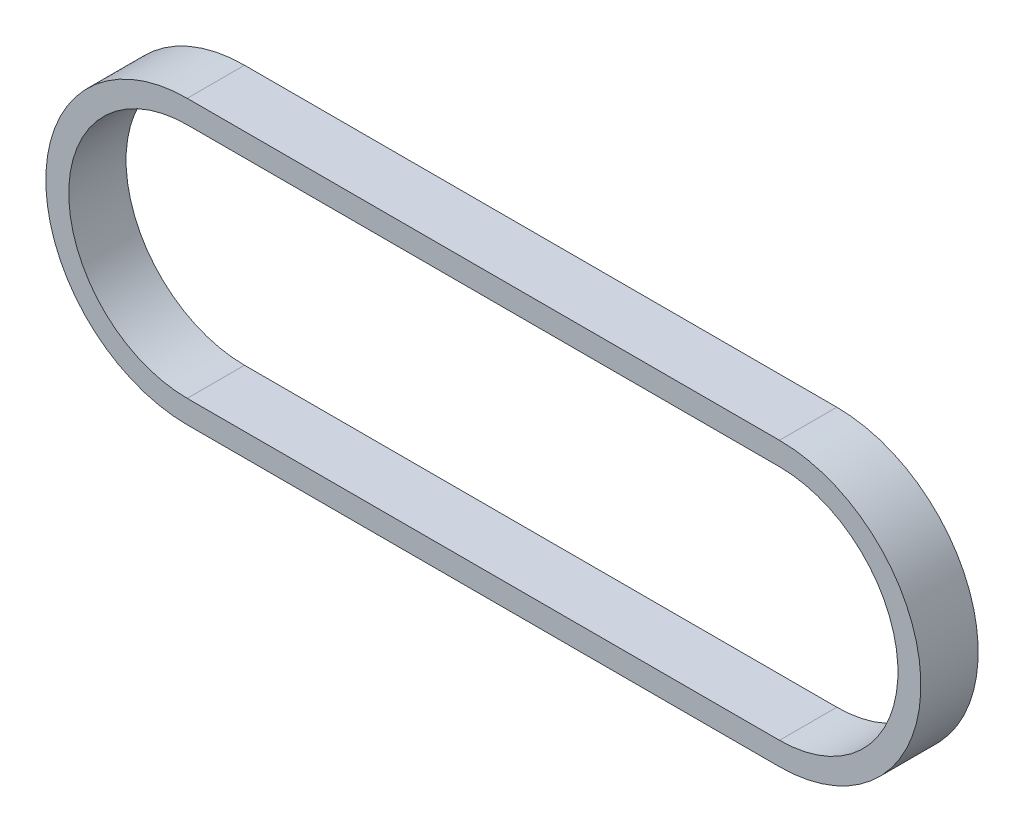
ISO-10303-21;
HEADER;
FILE_DESCRIPTION(('STEP AP214'),'2;1');
FILE_NAME('part.step','',(''),(''),'','','');
FILE_SCHEMA(('AUTOMOTIVE_DESIGN { 1 0 10303 214 1 1 1 1 }'));
ENDSEC;
DATA;
#1=APPLICATION_CONTEXT('core data for automotive mechanical design processes');
#2=APPLICATION_PROTOCOL_DEFINITION('international standard','automotive_design',2000,#1);
#3=PRODUCT_CONTEXT('',#1,'mechanical');
#4=PRODUCT('Part','Part','',(#3));
#5=PRODUCT_RELATED_PRODUCT_CATEGORY('part','',(#4));
#6=PRODUCT_DEFINITION_FORMATION('','',#4);
#7=PRODUCT_DEFINITION_CONTEXT('part definition',#1,'design');
#8=PRODUCT_DEFINITION('design','',#6,#7);
#9=PRODUCT_DEFINITION_SHAPE('','',#8);
#10=(LENGTH_UNIT() NAMED_UNIT(*) SI_UNIT(.MILLI.,.METRE.));
#11=(NAMED_UNIT(*) PLANE_ANGLE_UNIT() SI_UNIT($,.RADIAN.));
#12=(NAMED_UNIT(*) SI_UNIT($,.STERADIAN.) SOLID_ANGLE_UNIT());
#13=UNCERTAINTY_MEASURE_WITH_UNIT(LENGTH_MEASURE(1.E-05),#10,'distance_accuracy_value','');
#14=(GEOMETRIC_REPRESENTATION_CONTEXT(3) GLOBAL_UNCERTAINTY_ASSIGNED_CONTEXT((#13)) GLOBAL_UNIT_ASSIGNED_CONTEXT((#10,
#11,#12)) REPRESENTATION_CONTEXT('',''));
#15=CARTESIAN_POINT('',(0.,0.,0.));
#16=DIRECTION('',(0.,0.,1.));
#17=DIRECTION('',(1.,0.,0.));
#18=AXIS2_PLACEMENT_3D('',#15,#16,#17);
#19=CARTESIAN_POINT('',(0.,0.,6.));
#20=DIRECTION('',(0.,0.,1.));
#21=DIRECTION('',(1.,0.,0.));
#22=AXIS2_PLACEMENT_3D('',#19,#20,#21);
#23=PLANE('',#22);
#24=CARTESIAN_POINT('',(0.,0.,6.));
#25=DIRECTION('',(0.,0.,1.));
#26=DIRECTION('',(1.,0.,0.));
#27=AXIS2_PLACEMENT_3D('',#24,#25,#26);
#28=CIRCLE('',#27,14.8);
#29=CARTESIAN_POINT('',(0.,14.8,6.));
#30=VERTEX_POINT('',#29);
#31=CARTESIAN_POINT('',(0.,-14.8,6.));
#32=VERTEX_POINT('',#31);
#33=EDGE_CURVE('E134',#30,#32,#28,.T.);
#34=ORIENTED_EDGE('',*,*,#33,.T.);
#35=DIRECTION('',(1.,0.,0.));
#36=VECTOR('',#35,1.);
#37=CARTESIAN_POINT('',(0.,-14.8,6.));
#38=LINE('',#37,#36);
#39=CARTESIAN_POINT('',(62.,-14.8,6.));
#40=VERTEX_POINT('',#39);
#41=EDGE_CURVE('E137',#32,#40,#38,.T.);
#42=ORIENTED_EDGE('',*,*,#41,.T.);
#43=CARTESIAN_POINT('',(62.,0.,6.));
#44=DIRECTION('',(0.,0.,1.));
#45=DIRECTION('',(1.,0.,0.));
#46=AXIS2_PLACEMENT_3D('',#43,#44,#45);
#47=CIRCLE('',#46,14.8);
#48=CARTESIAN_POINT('',(62.,14.8,6.));
#49=VERTEX_POINT('',#48);
#50=EDGE_CURVE('E140',#40,#49,#47,.T.);
#51=ORIENTED_EDGE('',*,*,#50,.T.);
#52=DIRECTION('',(-1.,0.,0.));
#53=VECTOR('',#52,1.);
#54=CARTESIAN_POINT('',(0.,14.8,6.));
#55=LINE('',#54,#53);
#56=EDGE_CURVE('E142',#49,#30,#55,.T.);
#57=ORIENTED_EDGE('',*,*,#56,.T.);
#58=EDGE_LOOP('',(#34,#42,#51,#57));
#59=FACE_BOUND('',#58,.T.);
#60=DIRECTION('',(1.,0.,0.));
#61=VECTOR('',#60,1.);
#62=CARTESIAN_POINT('',(0.,-12.4,6.));
#63=LINE('',#62,#61);
#64=CARTESIAN_POINT('',(0.,-12.4,6.));
#65=VERTEX_POINT('',#64);
#66=CARTESIAN_POINT('',(62.,-12.4,6.));
#67=VERTEX_POINT('',#66);
#68=EDGE_CURVE('E106',#65,#67,#63,.T.);
#69=ORIENTED_EDGE('',*,*,#68,.F.);
#70=CARTESIAN_POINT('',(0.,0.,6.));
#71=DIRECTION('',(0.,0.,1.));
#72=DIRECTION('',(1.,0.,0.));
#73=AXIS2_PLACEMENT_3D('',#70,#71,#72);
#74=CIRCLE('',#73,12.4);
#75=CARTESIAN_POINT('',(0.,12.4,6.));
#76=VERTEX_POINT('',#75);
#77=EDGE_CURVE('E98',#76,#65,#74,.T.);
#78=ORIENTED_EDGE('',*,*,#77,.F.);
#79=DIRECTION('',(-1.,0.,0.));
#80=VECTOR('',#79,1.);
#81=CARTESIAN_POINT('',(0.,12.4,6.));
#82=LINE('',#81,#80);
#83=CARTESIAN_POINT('',(62.,12.4,6.));
#84=VERTEX_POINT('',#83);
#85=EDGE_CURVE('E120',#84,#76,#82,.T.);
#86=ORIENTED_EDGE('',*,*,#85,.F.);
#87=CARTESIAN_POINT('',(62.,0.,6.));
#88=DIRECTION('',(0.,0.,1.));
#89=DIRECTION('',(1.,0.,0.));
#90=AXIS2_PLACEMENT_3D('',#87,#88,#89);
#91=CIRCLE('',#90,12.4);
#92=EDGE_CURVE('E118',#67,#84,#91,.T.);
#93=ORIENTED_EDGE('',*,*,#92,.F.);
#94=EDGE_LOOP('',(#69,#78,#86,#93));
#95=FACE_BOUND('',#94,.T.);
#96=ADVANCED_FACE('F33',(#59,#95),#23,.T.);
#97=CARTESIAN_POINT('',(0.,0.,0.));
#98=DIRECTION('',(0.,0.,1.));
#99=DIRECTION('',(1.,0.,0.));
#100=AXIS2_PLACEMENT_3D('',#97,#98,#99);
#101=PLANE('',#100);
#102=CARTESIAN_POINT('',(0.,0.,0.));
#103=DIRECTION('',(0.,0.,1.));
#104=DIRECTION('',(1.,0.,0.));
#105=AXIS2_PLACEMENT_3D('',#102,#103,#104);
#106=CIRCLE('',#105,14.8);
#107=CARTESIAN_POINT('',(0.,14.8,0.));
#108=VERTEX_POINT('',#107);
#109=CARTESIAN_POINT('',(0.,-14.8,0.));
#110=VERTEX_POINT('',#109);
#111=EDGE_CURVE('E114',#108,#110,#106,.T.);
#112=ORIENTED_EDGE('',*,*,#111,.F.);
#113=DIRECTION('',(-1.,0.,0.));
#114=VECTOR('',#113,1.);
#115=CARTESIAN_POINT('',(0.,14.8,0.));
#116=LINE('',#115,#114);
#117=CARTESIAN_POINT('',(62.,14.8,0.));
#118=VERTEX_POINT('',#117);
#119=EDGE_CURVE('E138',#118,#108,#116,.T.);
#120=ORIENTED_EDGE('',*,*,#119,.F.);
#121=CARTESIAN_POINT('',(62.,0.,0.));
#122=DIRECTION('',(0.,0.,1.));
#123=DIRECTION('',(1.,0.,0.));
#124=AXIS2_PLACEMENT_3D('',#121,#122,#123);
#125=CIRCLE('',#124,14.8);
#126=CARTESIAN_POINT('',(62.,-14.8,0.));
#127=VERTEX_POINT('',#126);
#128=EDGE_CURVE('E149',#127,#118,#125,.T.);
#129=ORIENTED_EDGE('',*,*,#128,.F.);
#130=DIRECTION('',(1.,0.,0.));
#131=VECTOR('',#130,1.);
#132=CARTESIAN_POINT('',(0.,-14.8,0.));
#133=LINE('',#132,#131);
#134=EDGE_CURVE('E147',#110,#127,#133,.T.);
#135=ORIENTED_EDGE('',*,*,#134,.F.);
#136=EDGE_LOOP('',(#112,#120,#129,#135));
#137=FACE_BOUND('',#136,.T.);
#138=CARTESIAN_POINT('',(0.,0.,0.));
#139=DIRECTION('',(0.,0.,1.));
#140=DIRECTION('',(1.,0.,0.));
#141=AXIS2_PLACEMENT_3D('',#138,#139,#140);
#142=CIRCLE('',#141,12.4);
#143=CARTESIAN_POINT('',(0.,12.4,0.));
#144=VERTEX_POINT('',#143);
#145=CARTESIAN_POINT('',(0.,-12.4,0.));
#146=VERTEX_POINT('',#145);
#147=EDGE_CURVE('E56',#144,#146,#142,.T.);
#148=ORIENTED_EDGE('',*,*,#147,.T.);
#149=DIRECTION('',(1.,0.,0.));
#150=VECTOR('',#149,1.);
#151=CARTESIAN_POINT('',(0.,-12.4,0.));
#152=LINE('',#151,#150);
#153=CARTESIAN_POINT('',(62.,-12.4,0.));
#154=VERTEX_POINT('',#153);
#155=EDGE_CURVE('E113',#146,#154,#152,.T.);
#156=ORIENTED_EDGE('',*,*,#155,.T.);
#157=CARTESIAN_POINT('',(62.,0.,0.));
#158=DIRECTION('',(0.,0.,1.));
#159=DIRECTION('',(1.,0.,0.));
#160=AXIS2_PLACEMENT_3D('',#157,#158,#159);
#161=CIRCLE('',#160,12.4);
#162=CARTESIAN_POINT('',(62.,12.4,0.));
#163=VERTEX_POINT('',#162);
#164=EDGE_CURVE('E126',#154,#163,#161,.T.);
#165=ORIENTED_EDGE('',*,*,#164,.T.);
#166=DIRECTION('',(-1.,0.,0.));
#167=VECTOR('',#166,1.);
#168=CARTESIAN_POINT('',(0.,12.4,0.));
#169=LINE('',#168,#167);
#170=EDGE_CURVE('E107',#163,#144,#169,.T.);
#171=ORIENTED_EDGE('',*,*,#170,.T.);
#172=EDGE_LOOP('',(#148,#156,#165,#171));
#173=FACE_BOUND('',#172,.T.);
#174=ADVANCED_FACE('F167',(#137,#173),#101,.F.);
#175=CARTESIAN_POINT('',(0.,0.,6.));
#176=DIRECTION('',(0.,0.,-1.));
#177=DIRECTION('',(-1.,0.,0.));
#178=AXIS2_PLACEMENT_3D('',#175,#176,#177);
#179=CYLINDRICAL_SURFACE('',#178,14.8);
#180=ORIENTED_EDGE('',*,*,#111,.T.);
#181=DIRECTION('',(0.,0.,-1.));
#182=VECTOR('',#181,1.);
#183=CARTESIAN_POINT('',(0.,-14.8,6.));
#184=LINE('',#183,#182);
#185=EDGE_CURVE('E11',#32,#110,#184,.T.);
#186=ORIENTED_EDGE('',*,*,#185,.F.);
#187=ORIENTED_EDGE('',*,*,#33,.F.);
#188=DIRECTION('',(0.,0.,-1.));
#189=VECTOR('',#188,1.);
#190=CARTESIAN_POINT('',(0.,14.8,6.));
#191=LINE('',#190,#189);
#192=EDGE_CURVE('E144',#30,#108,#191,.T.);
#193=ORIENTED_EDGE('',*,*,#192,.T.);
#194=EDGE_LOOP('',(#180,#186,#187,#193));
#195=FACE_BOUND('',#194,.T.);
#196=ADVANCED_FACE('F35',(#195),#179,.T.);
#197=CARTESIAN_POINT('',(0.,-14.8,6.));
#198=DIRECTION('',(0.,1.,0.));
#199=DIRECTION('',(0.,0.,1.));
#200=AXIS2_PLACEMENT_3D('',#197,#198,#199);
#201=PLANE('',#200);
#202=ORIENTED_EDGE('',*,*,#134,.T.);
#203=DIRECTION('',(0.,0.,-1.));
#204=VECTOR('',#203,1.);
#205=CARTESIAN_POINT('',(62.,-14.8,6.));
#206=LINE('',#205,#204);
#207=EDGE_CURVE('E41',#40,#127,#206,.T.);
#208=ORIENTED_EDGE('',*,*,#207,.F.);
#209=ORIENTED_EDGE('',*,*,#41,.F.);
#210=ORIENTED_EDGE('',*,*,#185,.T.);
#211=EDGE_LOOP('',(#202,#208,#209,#210));
#212=FACE_BOUND('',#211,.T.);
#213=ADVANCED_FACE('F177',(#212),#201,.F.);
#214=CARTESIAN_POINT('',(62.,0.,6.));
#215=DIRECTION('',(0.,0.,-1.));
#216=DIRECTION('',(-1.,0.,0.));
#217=AXIS2_PLACEMENT_3D('',#214,#215,#216);
#218=CYLINDRICAL_SURFACE('',#217,14.8);
#219=ORIENTED_EDGE('',*,*,#128,.T.);
#220=DIRECTION('',(0.,0.,-1.));
#221=VECTOR('',#220,1.);
#222=CARTESIAN_POINT('',(62.,14.8,6.));
#223=LINE('',#222,#221);
#224=EDGE_CURVE('E154',#49,#118,#223,.T.);
#225=ORIENTED_EDGE('',*,*,#224,.F.);
#226=ORIENTED_EDGE('',*,*,#50,.F.);
#227=ORIENTED_EDGE('',*,*,#207,.T.);
#228=EDGE_LOOP('',(#219,#225,#226,#227));
#229=FACE_BOUND('',#228,.T.);
#230=ADVANCED_FACE('F161',(#229),#218,.T.);
#231=CARTESIAN_POINT('',(0.,14.8,6.));
#232=DIRECTION('',(0.,-1.,0.));
#233=DIRECTION('',(0.,0.,-1.));
#234=AXIS2_PLACEMENT_3D('',#231,#232,#233);
#235=PLANE('',#234);
#236=ORIENTED_EDGE('',*,*,#119,.T.);
#237=ORIENTED_EDGE('',*,*,#192,.F.);
#238=ORIENTED_EDGE('',*,*,#56,.F.);
#239=ORIENTED_EDGE('',*,*,#224,.T.);
#240=EDGE_LOOP('',(#236,#237,#238,#239));
#241=FACE_BOUND('',#240,.T.);
#242=ADVANCED_FACE('F171',(#241),#235,.F.);
#243=CARTESIAN_POINT('',(0.,0.,6.));
#244=DIRECTION('',(0.,0.,-1.));
#245=DIRECTION('',(-1.,0.,0.));
#246=AXIS2_PLACEMENT_3D('',#243,#244,#245);
#247=CYLINDRICAL_SURFACE('',#246,12.4);
#248=ORIENTED_EDGE('',*,*,#147,.F.);
#249=DIRECTION('',(0.,0.,-1.));
#250=VECTOR('',#249,1.);
#251=CARTESIAN_POINT('',(0.,12.4,6.));
#252=LINE('',#251,#250);
#253=EDGE_CURVE('E102',#76,#144,#252,.T.);
#254=ORIENTED_EDGE('',*,*,#253,.F.);
#255=ORIENTED_EDGE('',*,*,#77,.T.);
#256=DIRECTION('',(0.,0.,-1.));
#257=VECTOR('',#256,1.);
#258=CARTESIAN_POINT('',(0.,-12.4,6.));
#259=LINE('',#258,#257);
#260=EDGE_CURVE('E101',#65,#146,#259,.T.);
#261=ORIENTED_EDGE('',*,*,#260,.T.);
#262=EDGE_LOOP('',(#248,#254,#255,#261));
#263=FACE_BOUND('',#262,.T.);
#264=ADVANCED_FACE('F100',(#263),#247,.F.);
#265=CARTESIAN_POINT('',(0.,-12.4,6.));
#266=DIRECTION('',(0.,1.,0.));
#267=DIRECTION('',(0.,0.,1.));
#268=AXIS2_PLACEMENT_3D('',#265,#266,#267);
#269=PLANE('',#268);
#270=ORIENTED_EDGE('',*,*,#155,.F.);
#271=ORIENTED_EDGE('',*,*,#260,.F.);
#272=ORIENTED_EDGE('',*,*,#68,.T.);
#273=DIRECTION('',(0.,0.,-1.));
#274=VECTOR('',#273,1.);
#275=CARTESIAN_POINT('',(62.,-12.4,6.));
#276=LINE('',#275,#274);
#277=EDGE_CURVE('E115',#67,#154,#276,.T.);
#278=ORIENTED_EDGE('',*,*,#277,.T.);
#279=EDGE_LOOP('',(#270,#271,#272,#278));
#280=FACE_BOUND('',#279,.T.);
#281=ADVANCED_FACE('F110',(#280),#269,.T.);
#282=CARTESIAN_POINT('',(62.,0.,6.));
#283=DIRECTION('',(0.,0.,-1.));
#284=DIRECTION('',(-1.,0.,0.));
#285=AXIS2_PLACEMENT_3D('',#282,#283,#284);
#286=CYLINDRICAL_SURFACE('',#285,12.4);
#287=ORIENTED_EDGE('',*,*,#164,.F.);
#288=ORIENTED_EDGE('',*,*,#277,.F.);
#289=ORIENTED_EDGE('',*,*,#92,.T.);
#290=DIRECTION('',(0.,0.,-1.));
#291=VECTOR('',#290,1.);
#292=CARTESIAN_POINT('',(62.,12.4,6.));
#293=LINE('',#292,#291);
#294=EDGE_CURVE('E48',#84,#163,#293,.T.);
#295=ORIENTED_EDGE('',*,*,#294,.T.);
#296=EDGE_LOOP('',(#287,#288,#289,#295));
#297=FACE_BOUND('',#296,.T.);
#298=ADVANCED_FACE('F200',(#297),#286,.F.);
#299=CARTESIAN_POINT('',(0.,12.4,6.));
#300=DIRECTION('',(0.,-1.,0.));
#301=DIRECTION('',(0.,0.,-1.));
#302=AXIS2_PLACEMENT_3D('',#299,#300,#301);
#303=PLANE('',#302);
#304=ORIENTED_EDGE('',*,*,#170,.F.);
#305=ORIENTED_EDGE('',*,*,#294,.F.);
#306=ORIENTED_EDGE('',*,*,#85,.T.);
#307=ORIENTED_EDGE('',*,*,#253,.T.);
#308=EDGE_LOOP('',(#304,#305,#306,#307));
#309=FACE_BOUND('',#308,.T.);
#310=ADVANCED_FACE('F204',(#309),#303,.T.);
#311=CLOSED_SHELL('',(#96,#174,#196,#213,#230,#242,#264,#281,#298,#310));
#312=MANIFOLD_SOLID_BREP('B2',#311);
#313=ADVANCED_BREP_SHAPE_REPRESENTATION('',(#18,#312),#14);
#314=SHAPE_DEFINITION_REPRESENTATION(#9,#313);
ENDSEC;
END-ISO-10303-21;
